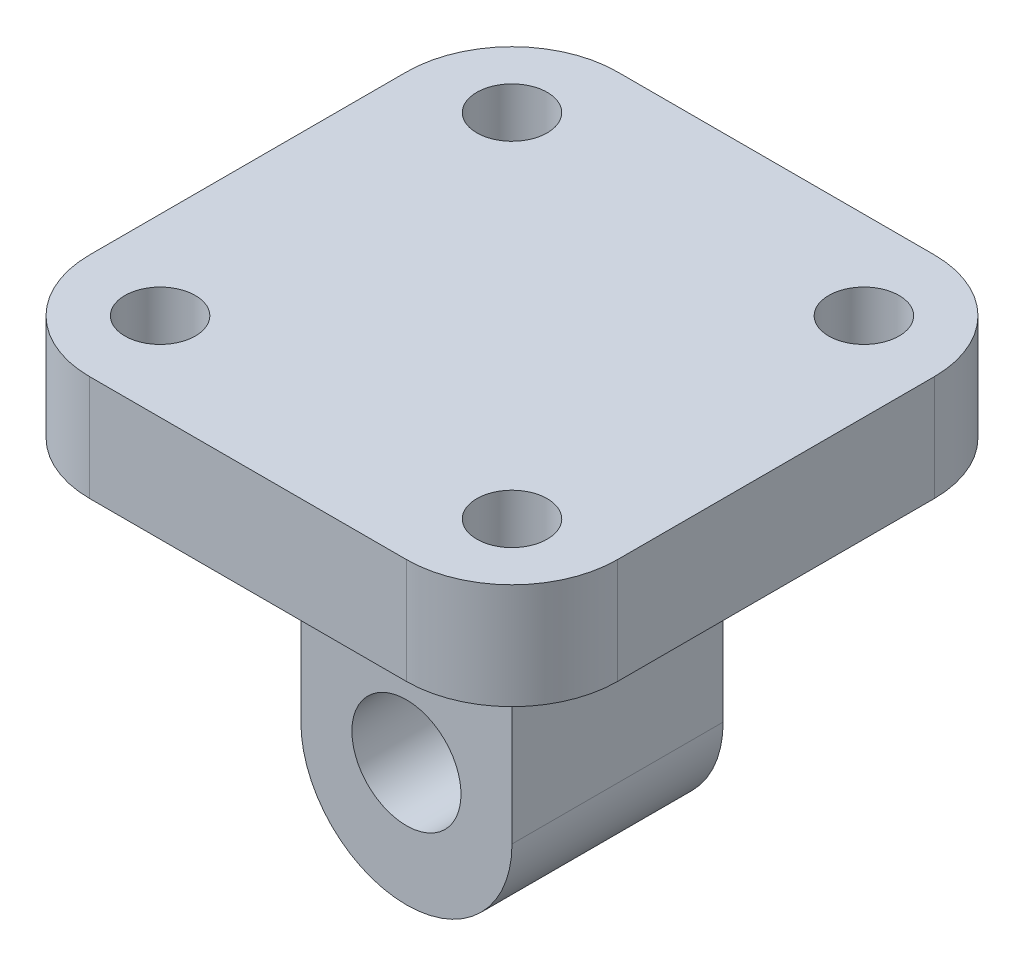
ISO-10303-21;
HEADER;
FILE_DESCRIPTION(('STEP AP214'),'2;1');
FILE_NAME('part.step','',(''),(''),'','','');
FILE_SCHEMA(('AUTOMOTIVE_DESIGN { 1 0 10303 214 1 1 1 1 }'));
ENDSEC;
DATA;
#1=APPLICATION_CONTEXT('core data for automotive mechanical design processes');
#2=APPLICATION_PROTOCOL_DEFINITION('international standard','automotive_design',2000,#1);
#3=PRODUCT_CONTEXT('',#1,'mechanical');
#4=PRODUCT('Part','Part','',(#3));
#5=PRODUCT_RELATED_PRODUCT_CATEGORY('part','',(#4));
#6=PRODUCT_DEFINITION_FORMATION('','',#4);
#7=PRODUCT_DEFINITION_CONTEXT('part definition',#1,'design');
#8=PRODUCT_DEFINITION('design','',#6,#7);
#9=PRODUCT_DEFINITION_SHAPE('','',#8);
#10=(LENGTH_UNIT() NAMED_UNIT(*) SI_UNIT(.MILLI.,.METRE.));
#11=(NAMED_UNIT(*) PLANE_ANGLE_UNIT() SI_UNIT($,.RADIAN.));
#12=(NAMED_UNIT(*) SI_UNIT($,.STERADIAN.) SOLID_ANGLE_UNIT());
#13=UNCERTAINTY_MEASURE_WITH_UNIT(LENGTH_MEASURE(1.E-05),#10,'distance_accuracy_value','');
#14=(GEOMETRIC_REPRESENTATION_CONTEXT(3) GLOBAL_UNCERTAINTY_ASSIGNED_CONTEXT((#13)) GLOBAL_UNIT_ASSIGNED_CONTEXT((#10,
#11,#12)) REPRESENTATION_CONTEXT('',''));
#15=CARTESIAN_POINT('',(0.,0.,0.));
#16=DIRECTION('',(0.,0.,1.));
#17=DIRECTION('',(1.,0.,0.));
#18=AXIS2_PLACEMENT_3D('',#15,#16,#17);
#19=CARTESIAN_POINT('',(0.,0.,0.));
#20=DIRECTION('',(0.,1.,0.));
#21=DIRECTION('',(0.,0.,1.));
#22=AXIS2_PLACEMENT_3D('',#19,#20,#21);
#23=PLANE('',#22);
#24=DIRECTION('',(0.,0.,-1.));
#25=VECTOR('',#24,1.);
#26=CARTESIAN_POINT('',(15.,0.,0.));
#27=LINE('',#26,#25);
#28=CARTESIAN_POINT('',(15.,0.,12.));
#29=VERTEX_POINT('',#28);
#30=CARTESIAN_POINT('',(15.,0.,3.));
#31=VERTEX_POINT('',#30);
#32=EDGE_CURVE('E185',#29,#31,#27,.T.);
#33=ORIENTED_EDGE('',*,*,#32,.F.);
#34=CARTESIAN_POINT('',(12.,0.,12.));
#35=DIRECTION('',(0.,1.,0.));
#36=DIRECTION('',(0.,0.,1.));
#37=AXIS2_PLACEMENT_3D('',#34,#35,#36);
#38=CIRCLE('',#37,3.);
#39=CARTESIAN_POINT('',(12.,0.,15.));
#40=VERTEX_POINT('',#39);
#41=EDGE_CURVE('E168',#29,#40,#38,.F.);
#42=ORIENTED_EDGE('',*,*,#41,.T.);
#43=DIRECTION('',(1.,0.,0.));
#44=VECTOR('',#43,1.);
#45=CARTESIAN_POINT('',(0.,0.,15.));
#46=LINE('',#45,#44);
#47=CARTESIAN_POINT('',(3.,0.,15.));
#48=VERTEX_POINT('',#47);
#49=EDGE_CURVE('E196',#48,#40,#46,.T.);
#50=ORIENTED_EDGE('',*,*,#49,.F.);
#51=CARTESIAN_POINT('',(3.,0.,12.));
#52=DIRECTION('',(0.,1.,0.));
#53=DIRECTION('',(0.,0.,1.));
#54=AXIS2_PLACEMENT_3D('',#51,#52,#53);
#55=CIRCLE('',#54,3.);
#56=CARTESIAN_POINT('',(0.,0.,12.));
#57=VERTEX_POINT('',#56);
#58=EDGE_CURVE('E179',#48,#57,#55,.F.);
#59=ORIENTED_EDGE('',*,*,#58,.T.);
#60=DIRECTION('',(0.,0.,1.));
#61=VECTOR('',#60,1.);
#62=CARTESIAN_POINT('',(0.,0.,0.));
#63=LINE('',#62,#61);
#64=CARTESIAN_POINT('',(0.,0.,3.));
#65=VERTEX_POINT('',#64);
#66=EDGE_CURVE('E201',#65,#57,#63,.T.);
#67=ORIENTED_EDGE('',*,*,#66,.F.);
#68=CARTESIAN_POINT('',(3.,0.,3.));
#69=DIRECTION('',(0.,1.,0.));
#70=DIRECTION('',(0.,0.,1.));
#71=AXIS2_PLACEMENT_3D('',#68,#69,#70);
#72=CIRCLE('',#71,3.);
#73=CARTESIAN_POINT('',(3.,0.,0.));
#74=VERTEX_POINT('',#73);
#75=EDGE_CURVE('E189',#65,#74,#72,.F.);
#76=ORIENTED_EDGE('',*,*,#75,.T.);
#77=DIRECTION('',(-1.,0.,0.));
#78=VECTOR('',#77,1.);
#79=CARTESIAN_POINT('',(0.,0.,0.));
#80=LINE('',#79,#78);
#81=CARTESIAN_POINT('',(12.,0.,0.));
#82=VERTEX_POINT('',#81);
#83=EDGE_CURVE('E195',#82,#74,#80,.T.);
#84=ORIENTED_EDGE('',*,*,#83,.F.);
#85=CARTESIAN_POINT('',(12.,0.,3.));
#86=DIRECTION('',(0.,1.,0.));
#87=DIRECTION('',(0.,0.,1.));
#88=AXIS2_PLACEMENT_3D('',#85,#86,#87);
#89=CIRCLE('',#88,3.);
#90=EDGE_CURVE('E194',#82,#31,#89,.F.);
#91=ORIENTED_EDGE('',*,*,#90,.T.);
#92=EDGE_LOOP('',(#33,#42,#50,#59,#67,#76,#84,#91));
#93=FACE_BOUND('',#92,.T.);
#94=CARTESIAN_POINT('',(2.49999999999996,0.,2.5));
#95=DIRECTION('',(0.,1.,0.));
#96=DIRECTION('',(0.,0.,1.));
#97=AXIS2_PLACEMENT_3D('',#94,#95,#96);
#98=CIRCLE('',#97,1.);
#99=CARTESIAN_POINT('',(3.49999999999997,0.,2.5));
#100=VERTEX_POINT('',#99);
#101=CARTESIAN_POINT('',(2.5,0.,3.5));
#102=VERTEX_POINT('',#101);
#103=EDGE_CURVE('E439',#100,#102,#98,.T.);
#104=ORIENTED_EDGE('',*,*,#103,.T.);
#105=DIRECTION('',(0.,0.,-1.));
#106=VECTOR('',#105,1.);
#107=CARTESIAN_POINT('',(2.5,0.,10.5));
#108=LINE('',#107,#106);
#109=CARTESIAN_POINT('',(2.5,0.,11.5));
#110=VERTEX_POINT('',#109);
#111=EDGE_CURVE('E257',#102,#110,#108,.F.);
#112=ORIENTED_EDGE('',*,*,#111,.T.);
#113=CARTESIAN_POINT('',(2.5,0.,12.5));
#114=DIRECTION('',(0.,1.,0.));
#115=DIRECTION('',(0.,0.,1.));
#116=AXIS2_PLACEMENT_3D('',#113,#114,#115);
#117=CIRCLE('',#116,1.);
#118=CARTESIAN_POINT('',(3.5,0.,12.5));
#119=VERTEX_POINT('',#118);
#120=EDGE_CURVE('E444',#110,#119,#117,.T.);
#121=ORIENTED_EDGE('',*,*,#120,.T.);
#122=DIRECTION('',(-1.,0.,0.));
#123=VECTOR('',#122,1.);
#124=CARTESIAN_POINT('',(10.5,0.,12.5));
#125=LINE('',#124,#123);
#126=CARTESIAN_POINT('',(11.5,0.,12.5));
#127=VERTEX_POINT('',#126);
#128=EDGE_CURVE('E255',#119,#127,#125,.F.);
#129=ORIENTED_EDGE('',*,*,#128,.T.);
#130=CARTESIAN_POINT('',(12.5,0.,12.5));
#131=DIRECTION('',(0.,1.,0.));
#132=DIRECTION('',(0.,0.,1.));
#133=AXIS2_PLACEMENT_3D('',#130,#131,#132);
#134=CIRCLE('',#133,1.);
#135=CARTESIAN_POINT('',(12.5,0.,11.5));
#136=VERTEX_POINT('',#135);
#137=EDGE_CURVE('E427',#127,#136,#134,.T.);
#138=ORIENTED_EDGE('',*,*,#137,.T.);
#139=DIRECTION('',(0.,0.,1.));
#140=VECTOR('',#139,1.);
#141=CARTESIAN_POINT('',(12.5,0.,4.5));
#142=LINE('',#141,#140);
#143=CARTESIAN_POINT('',(12.5,0.,3.5));
#144=VERTEX_POINT('',#143);
#145=EDGE_CURVE('E253',#136,#144,#142,.F.);
#146=ORIENTED_EDGE('',*,*,#145,.T.);
#147=CARTESIAN_POINT('',(12.5,0.,2.5));
#148=DIRECTION('',(0.,1.,0.));
#149=DIRECTION('',(0.,0.,1.));
#150=AXIS2_PLACEMENT_3D('',#147,#148,#149);
#151=CIRCLE('',#150,1.);
#152=CARTESIAN_POINT('',(11.5,0.,2.5));
#153=VERTEX_POINT('',#152);
#154=EDGE_CURVE('E433',#144,#153,#151,.T.);
#155=ORIENTED_EDGE('',*,*,#154,.T.);
#156=DIRECTION('',(1.,0.,0.));
#157=VECTOR('',#156,1.);
#158=CARTESIAN_POINT('',(4.5,0.,2.5));
#159=LINE('',#158,#157);
#160=EDGE_CURVE('E251',#153,#100,#159,.F.);
#161=ORIENTED_EDGE('',*,*,#160,.T.);
#162=EDGE_LOOP('',(#104,#112,#121,#129,#138,#146,#155,#161));
#163=FACE_BOUND('',#162,.T.);
#164=ADVANCED_FACE('F33',(#93,#163),#23,.F.);
#165=CARTESIAN_POINT('',(0.,3.,0.));
#166=DIRECTION('',(1.,0.,0.));
#167=DIRECTION('',(0.,0.,-1.));
#168=AXIS2_PLACEMENT_3D('',#165,#166,#167);
#169=PLANE('',#168);
#170=ORIENTED_EDGE('',*,*,#66,.T.);
#171=DIRECTION('',(0.,-1.,0.));
#172=VECTOR('',#171,1.);
#173=CARTESIAN_POINT('',(0.,3.,12.));
#174=LINE('',#173,#172);
#175=CARTESIAN_POINT('',(0.,3.,12.));
#176=VERTEX_POINT('',#175);
#177=EDGE_CURVE('E224',#57,#176,#174,.F.);
#178=ORIENTED_EDGE('',*,*,#177,.T.);
#179=DIRECTION('',(0.,0.,1.));
#180=VECTOR('',#179,1.);
#181=CARTESIAN_POINT('',(0.,3.,0.));
#182=LINE('',#181,#180);
#183=CARTESIAN_POINT('',(0.,3.,3.));
#184=VERTEX_POINT('',#183);
#185=EDGE_CURVE('E199',#184,#176,#182,.T.);
#186=ORIENTED_EDGE('',*,*,#185,.F.);
#187=DIRECTION('',(0.,-1.,0.));
#188=VECTOR('',#187,1.);
#189=CARTESIAN_POINT('',(0.,3.,3.));
#190=LINE('',#189,#188);
#191=EDGE_CURVE('E221',#184,#65,#190,.T.);
#192=ORIENTED_EDGE('',*,*,#191,.T.);
#193=EDGE_LOOP('',(#170,#178,#186,#192));
#194=FACE_BOUND('',#193,.T.);
#195=ADVANCED_FACE('F357',(#194),#169,.F.);
#196=CARTESIAN_POINT('',(0.,3.,15.));
#197=DIRECTION('',(0.,0.,-1.));
#198=DIRECTION('',(-1.,0.,0.));
#199=AXIS2_PLACEMENT_3D('',#196,#197,#198);
#200=PLANE('',#199);
#201=ORIENTED_EDGE('',*,*,#49,.T.);
#202=DIRECTION('',(0.,-1.,0.));
#203=VECTOR('',#202,1.);
#204=CARTESIAN_POINT('',(12.,3.,15.));
#205=LINE('',#204,#203);
#206=CARTESIAN_POINT('',(12.,3.,15.));
#207=VERTEX_POINT('',#206);
#208=EDGE_CURVE('E173',#40,#207,#205,.F.);
#209=ORIENTED_EDGE('',*,*,#208,.T.);
#210=DIRECTION('',(1.,0.,0.));
#211=VECTOR('',#210,1.);
#212=CARTESIAN_POINT('',(0.,3.,15.));
#213=LINE('',#212,#211);
#214=CARTESIAN_POINT('',(3.,3.,15.));
#215=VERTEX_POINT('',#214);
#216=EDGE_CURVE('E451',#215,#207,#213,.T.);
#217=ORIENTED_EDGE('',*,*,#216,.F.);
#218=DIRECTION('',(0.,-1.,0.));
#219=VECTOR('',#218,1.);
#220=CARTESIAN_POINT('',(3.,3.,15.));
#221=LINE('',#220,#219);
#222=EDGE_CURVE('E178',#215,#48,#221,.T.);
#223=ORIENTED_EDGE('',*,*,#222,.T.);
#224=EDGE_LOOP('',(#201,#209,#217,#223));
#225=FACE_BOUND('',#224,.T.);
#226=ADVANCED_FACE('F364',(#225),#200,.F.);
#227=CARTESIAN_POINT('',(15.,3.,0.));
#228=DIRECTION('',(-1.,0.,0.));
#229=DIRECTION('',(0.,0.,1.));
#230=AXIS2_PLACEMENT_3D('',#227,#228,#229);
#231=PLANE('',#230);
#232=DIRECTION('',(0.,0.,-1.));
#233=VECTOR('',#232,1.);
#234=CARTESIAN_POINT('',(15.,3.,0.));
#235=LINE('',#234,#233);
#236=CARTESIAN_POINT('',(15.,3.,12.));
#237=VERTEX_POINT('',#236);
#238=CARTESIAN_POINT('',(15.,3.,3.));
#239=VERTEX_POINT('',#238);
#240=EDGE_CURVE('E188',#237,#239,#235,.T.);
#241=ORIENTED_EDGE('',*,*,#240,.F.);
#242=DIRECTION('',(0.,-1.,0.));
#243=VECTOR('',#242,1.);
#244=CARTESIAN_POINT('',(15.,3.,12.));
#245=LINE('',#244,#243);
#246=EDGE_CURVE('E172',#237,#29,#245,.T.);
#247=ORIENTED_EDGE('',*,*,#246,.T.);
#248=ORIENTED_EDGE('',*,*,#32,.T.);
#249=DIRECTION('',(0.,-1.,0.));
#250=VECTOR('',#249,1.);
#251=CARTESIAN_POINT('',(15.,3.,3.));
#252=LINE('',#251,#250);
#253=EDGE_CURVE('E190',#31,#239,#252,.F.);
#254=ORIENTED_EDGE('',*,*,#253,.T.);
#255=EDGE_LOOP('',(#241,#247,#248,#254));
#256=FACE_BOUND('',#255,.T.);
#257=ADVANCED_FACE('F184',(#256),#231,.F.);
#258=CARTESIAN_POINT('',(0.,3.,0.));
#259=DIRECTION('',(0.,0.,1.));
#260=DIRECTION('',(1.,0.,0.));
#261=AXIS2_PLACEMENT_3D('',#258,#259,#260);
#262=PLANE('',#261);
#263=DIRECTION('',(-1.,0.,0.));
#264=VECTOR('',#263,1.);
#265=CARTESIAN_POINT('',(0.,3.,0.));
#266=LINE('',#265,#264);
#267=CARTESIAN_POINT('',(12.,3.,0.));
#268=VERTEX_POINT('',#267);
#269=CARTESIAN_POINT('',(3.,3.,0.));
#270=VERTEX_POINT('',#269);
#271=EDGE_CURVE('E205',#268,#270,#266,.T.);
#272=ORIENTED_EDGE('',*,*,#271,.F.);
#273=DIRECTION('',(0.,-1.,0.));
#274=VECTOR('',#273,1.);
#275=CARTESIAN_POINT('',(12.,3.,0.));
#276=LINE('',#275,#274);
#277=EDGE_CURVE('E228',#268,#82,#276,.T.);
#278=ORIENTED_EDGE('',*,*,#277,.T.);
#279=ORIENTED_EDGE('',*,*,#83,.T.);
#280=DIRECTION('',(0.,-1.,0.));
#281=VECTOR('',#280,1.);
#282=CARTESIAN_POINT('',(3.,3.,0.));
#283=LINE('',#282,#281);
#284=EDGE_CURVE('E226',#74,#270,#283,.F.);
#285=ORIENTED_EDGE('',*,*,#284,.T.);
#286=EDGE_LOOP('',(#272,#278,#279,#285));
#287=FACE_BOUND('',#286,.T.);
#288=ADVANCED_FACE('F370',(#287),#262,.F.);
#289=CARTESIAN_POINT('',(0.,3.,0.));
#290=DIRECTION('',(0.,1.,0.));
#291=DIRECTION('',(0.,0.,1.));
#292=AXIS2_PLACEMENT_3D('',#289,#290,#291);
#293=PLANE('',#292);
#294=CARTESIAN_POINT('',(12.5,3.,12.5));
#295=DIRECTION('',(0.,1.,0.));
#296=DIRECTION('',(0.,0.,1.));
#297=AXIS2_PLACEMENT_3D('',#294,#295,#296);
#298=CIRCLE('',#297,1.);
#299=CARTESIAN_POINT('',(12.5,3.,13.5));
#300=VERTEX_POINT('',#299);
#301=EDGE_CURVE('E430',#300,#300,#298,.T.);
#302=ORIENTED_EDGE('',*,*,#301,.F.);
#303=EDGE_LOOP('',(#302));
#304=FACE_BOUND('',#303,.T.);
#305=CARTESIAN_POINT('',(12.5,3.,2.5));
#306=DIRECTION('',(0.,1.,0.));
#307=DIRECTION('',(0.,0.,1.));
#308=AXIS2_PLACEMENT_3D('',#305,#306,#307);
#309=CIRCLE('',#308,1.);
#310=CARTESIAN_POINT('',(12.5,3.,3.5));
#311=VERTEX_POINT('',#310);
#312=EDGE_CURVE('E436',#311,#311,#309,.T.);
#313=ORIENTED_EDGE('',*,*,#312,.F.);
#314=EDGE_LOOP('',(#313));
#315=FACE_BOUND('',#314,.T.);
#316=CARTESIAN_POINT('',(2.49999999999996,3.,2.5));
#317=DIRECTION('',(0.,1.,0.));
#318=DIRECTION('',(0.,0.,1.));
#319=AXIS2_PLACEMENT_3D('',#316,#317,#318);
#320=CIRCLE('',#319,1.);
#321=CARTESIAN_POINT('',(2.49999999999996,3.,3.5));
#322=VERTEX_POINT('',#321);
#323=EDGE_CURVE('E426',#322,#322,#320,.T.);
#324=ORIENTED_EDGE('',*,*,#323,.F.);
#325=EDGE_LOOP('',(#324));
#326=FACE_BOUND('',#325,.T.);
#327=CARTESIAN_POINT('',(2.5,3.,12.5));
#328=DIRECTION('',(0.,1.,0.));
#329=DIRECTION('',(0.,0.,1.));
#330=AXIS2_PLACEMENT_3D('',#327,#328,#329);
#331=CIRCLE('',#330,1.);
#332=CARTESIAN_POINT('',(2.5,3.,13.5));
#333=VERTEX_POINT('',#332);
#334=EDGE_CURVE('E429',#333,#333,#331,.T.);
#335=ORIENTED_EDGE('',*,*,#334,.F.);
#336=EDGE_LOOP('',(#335));
#337=FACE_BOUND('',#336,.T.);
#338=ORIENTED_EDGE('',*,*,#216,.T.);
#339=CARTESIAN_POINT('',(12.,3.,12.));
#340=DIRECTION('',(0.,1.,0.));
#341=DIRECTION('',(0.,0.,1.));
#342=AXIS2_PLACEMENT_3D('',#339,#340,#341);
#343=CIRCLE('',#342,3.);
#344=EDGE_CURVE('E219',#207,#237,#343,.T.);
#345=ORIENTED_EDGE('',*,*,#344,.T.);
#346=ORIENTED_EDGE('',*,*,#240,.T.);
#347=CARTESIAN_POINT('',(12.,3.,3.));
#348=DIRECTION('',(0.,1.,0.));
#349=DIRECTION('',(0.,0.,1.));
#350=AXIS2_PLACEMENT_3D('',#347,#348,#349);
#351=CIRCLE('',#350,3.);
#352=EDGE_CURVE('E215',#239,#268,#351,.T.);
#353=ORIENTED_EDGE('',*,*,#352,.T.);
#354=ORIENTED_EDGE('',*,*,#271,.T.);
#355=CARTESIAN_POINT('',(3.,3.,3.));
#356=DIRECTION('',(0.,1.,0.));
#357=DIRECTION('',(0.,0.,1.));
#358=AXIS2_PLACEMENT_3D('',#355,#356,#357);
#359=CIRCLE('',#358,3.);
#360=EDGE_CURVE('E213',#270,#184,#359,.T.);
#361=ORIENTED_EDGE('',*,*,#360,.T.);
#362=ORIENTED_EDGE('',*,*,#185,.T.);
#363=CARTESIAN_POINT('',(3.,3.,12.));
#364=DIRECTION('',(0.,1.,0.));
#365=DIRECTION('',(0.,0.,1.));
#366=AXIS2_PLACEMENT_3D('',#363,#364,#365);
#367=CIRCLE('',#366,3.);
#368=EDGE_CURVE('E217',#176,#215,#367,.T.);
#369=ORIENTED_EDGE('',*,*,#368,.T.);
#370=EDGE_LOOP('',(#338,#345,#346,#353,#354,#361,#362,#369));
#371=FACE_BOUND('',#370,.T.);
#372=ADVANCED_FACE('F369',(#304,#315,#326,#337,#371),#293,.T.);
#373=CARTESIAN_POINT('',(2.5,0.,12.5));
#374=DIRECTION('',(0.,1.,0.));
#375=DIRECTION('',(0.,0.,1.));
#376=AXIS2_PLACEMENT_3D('',#373,#374,#375);
#377=CYLINDRICAL_SURFACE('',#376,1.);
#378=CARTESIAN_POINT('',(2.5,0.,11.5));
#379=CARTESIAN_POINT('',(2.52640180333268,2.64924350101226E-06,11.499998705182));
#380=CARTESIAN_POINT('',(2.55278937642562,-0.000523387453102627,11.5010463425146));
#381=CARTESIAN_POINT('',(2.60534952735425,-0.00260382393645436,11.5052154381789));
#382=CARTESIAN_POINT('',(2.63152218298236,-0.00415783337280311,11.5083361093227));
#383=CARTESIAN_POINT('',(2.70920047399927,-0.0102977843524348,11.5207301055521));
#384=CARTESIAN_POINT('',(2.76014211509002,-0.0163622677799502,11.5330359960663));
#385=CARTESIAN_POINT('',(2.85892780525675,-0.031834040648478,11.5651878812173));
#386=CARTESIAN_POINT('',(2.90677500432708,-0.041237865407464,11.5850260623137));
#387=CARTESIAN_POINT('',(2.99844728291163,-0.062536701636154,11.6315579419229));
#388=CARTESIAN_POINT('',(3.04227016571173,-0.0744330621922426,11.6582553547764));
#389=CARTESIAN_POINT('',(3.10568795580045,-0.0937795169253797,11.7038331289303));
#390=CARTESIAN_POINT('',(3.12704209361127,-0.10071237208584,11.7205437472963));
#391=CARTESIAN_POINT('',(3.16822005757542,-0.114806689591457,11.7555481269127));
#392=CARTESIAN_POINT('',(3.18804802572463,-0.121967452827616,11.7738372951724));
#393=CARTESIAN_POINT('',(3.20710678118655,-0.12917130661303,11.7928932188135));
#394=B_SPLINE_CURVE_WITH_KNOTS('',3,(#378,#379,#380,#381,#382,#383,#384,#385,#386,#387,#388,
#389,#390,#391,#392,#393),.UNSPECIFIED.,.F.,.F.,(4,2,2,2,2,2,2,4),(0.,0.0791518631060229,
0.158273687245464,0.315701689693855,0.472966830102965,0.630317311267802,0.714204480217141,
0.797855305489649),.UNSPECIFIED.);
#395=CARTESIAN_POINT('',(3.20710678118655,-0.12917130661303,11.7928932188135));
#396=VERTEX_POINT('',#395);
#397=EDGE_CURVE('E273',#110,#396,#394,.T.);
#398=ORIENTED_EDGE('',*,*,#397,.T.);
#399=CARTESIAN_POINT('',(3.20710678118655,-0.12917130661303,11.7928932188135));
#400=CARTESIAN_POINT('',(3.24582225886051,-0.114509631506998,11.8315795391901));
#401=CARTESIAN_POINT('',(3.2814163855766,-0.100052017649465,11.873557852516));
#402=CARTESIAN_POINT('',(3.34562384883322,-0.0727741457450642,11.9633686103649));
#403=CARTESIAN_POINT('',(3.37419951461683,-0.0599628921679715,12.0112306618911));
#404=CARTESIAN_POINT('',(3.42328718839398,-0.0373510463848847,12.1118191710885));
#405=CARTESIAN_POINT('',(3.44377206420896,-0.0275606079877281,12.1645612762958));
#406=CARTESIAN_POINT('',(3.47556111020055,-0.0121565893196397,12.2731573803136));
#407=CARTESIAN_POINT('',(3.4869030780324,-0.00652582073716252,12.3289975365081));
#408=CARTESIAN_POINT('',(3.49560904393304,-0.0021922191321529,12.404441590425));
#409=CARTESIAN_POINT('',(3.49725434609723,-0.00137153604835543,12.4235063555391));
#410=CARTESIAN_POINT('',(3.49944916459418,-0.000275689396311236,12.461710845539));
#411=CARTESIAN_POINT('',(3.49999888875343,-4.22365016079815E-07,12.4808505555178));
#412=CARTESIAN_POINT('',(3.5,0.,12.5));
#413=B_SPLINE_CURVE_WITH_KNOTS('',3,(#399,#400,#401,#402,#403,#404,#405,#406,#407,#408,#409,
#410,#411,#412),.UNSPECIFIED.,.F.,.F.,(4,2,2,2,2,2,4),(0.,0.169909956082648,0.340712876120193,
0.512083810947109,0.68274259541558,0.740172645603618,0.797591800518008),.UNSPECIFIED.);
#414=EDGE_CURVE('E327',#396,#119,#413,.T.);
#415=ORIENTED_EDGE('',*,*,#414,.T.);
#416=ORIENTED_EDGE('',*,*,#120,.F.);
#417=EDGE_LOOP('',(#398,#415,#416));
#418=FACE_BOUND('',#417,.T.);
#419=ORIENTED_EDGE('',*,*,#334,.T.);
#420=EDGE_LOOP('',(#419));
#421=FACE_BOUND('',#420,.T.);
#422=ADVANCED_FACE('F353',(#418,#421),#377,.F.);
#423=CARTESIAN_POINT('',(2.49999999999996,0.,2.5));
#424=DIRECTION('',(0.,1.,0.));
#425=DIRECTION('',(0.,0.,1.));
#426=AXIS2_PLACEMENT_3D('',#423,#424,#425);
#427=CYLINDRICAL_SURFACE('',#426,1.);
#428=ORIENTED_EDGE('',*,*,#103,.F.);
#429=CARTESIAN_POINT('',(3.49999999999997,0.,2.5));
#430=CARTESIAN_POINT('',(3.50000129481794,2.64924350101993E-06,2.52640180333268));
#431=CARTESIAN_POINT('',(3.49895365748535,-0.000523387453102599,2.55278937642562));
#432=CARTESIAN_POINT('',(3.49478456182108,-0.0026038239364543,2.60534952735425));
#433=CARTESIAN_POINT('',(3.49166389067722,-0.00415783337280303,2.63152218298236));
#434=CARTESIAN_POINT('',(3.47926989444785,-0.0102977843524347,2.70920047399927));
#435=CARTESIAN_POINT('',(3.4669640039337,-0.0163622677799501,2.76014211509002));
#436=CARTESIAN_POINT('',(3.43481211878264,-0.0318340406484782,2.85892780525675));
#437=CARTESIAN_POINT('',(3.41497393768624,-0.0412378654074642,2.90677500432707));
#438=CARTESIAN_POINT('',(3.36844205807707,-0.0625367016361543,2.99844728291163));
#439=CARTESIAN_POINT('',(3.34174464522355,-0.0744330621922428,3.04227016571173));
#440=CARTESIAN_POINT('',(3.2961668710697,-0.0937795169253786,3.10568795580045));
#441=CARTESIAN_POINT('',(3.27945625270367,-0.100712372085838,3.12704209361126));
#442=CARTESIAN_POINT('',(3.24445187308725,-0.114806689591452,3.16822005757541));
#443=CARTESIAN_POINT('',(3.22616270482755,-0.12196745282761,3.18804802572461));
#444=CARTESIAN_POINT('',(3.20710678118653,-0.129171306613022,3.20710678118653));
#445=B_SPLINE_CURVE_WITH_KNOTS('',3,(#429,#430,#431,#432,#433,#434,#435,#436,#437,#438,#439,
#440,#441,#442,#443,#444),.UNSPECIFIED.,.F.,.F.,(4,2,2,2,2,2,2,4),(0.,0.0791518631060225,
0.158273687245463,0.315701689693856,0.472966830102965,0.630317311267802,0.714204480217125,
0.79785530548962),.UNSPECIFIED.);
#446=CARTESIAN_POINT('',(3.20710678118653,-0.129171306613022,3.20710678118653));
#447=VERTEX_POINT('',#446);
#448=EDGE_CURVE('E11',#100,#447,#445,.T.);
#449=ORIENTED_EDGE('',*,*,#448,.T.);
#450=CARTESIAN_POINT('',(3.20710678118653,-0.129171306613022,3.20710678118653));
#451=CARTESIAN_POINT('',(3.16842046080985,-0.114509631506992,3.24582225886049));
#452=CARTESIAN_POINT('',(3.12644214748401,-0.100052017649459,3.28141638557658));
#453=CARTESIAN_POINT('',(3.03663138963511,-0.0727741457450602,3.34562384883321));
#454=CARTESIAN_POINT('',(2.98876933810885,-0.0599628921679682,3.37419951461682));
#455=CARTESIAN_POINT('',(2.88818082891148,-0.0373510463848825,3.42328718839397));
#456=CARTESIAN_POINT('',(2.83543872370417,-0.0275606079877262,3.44377206420895));
#457=CARTESIAN_POINT('',(2.72684261968638,-0.0121565893196385,3.47556111020054));
#458=CARTESIAN_POINT('',(2.67100246349194,-0.00652582073716172,3.48690307803239));
#459=CARTESIAN_POINT('',(2.59555840957495,-0.00219221913215275,3.49560904393303));
#460=CARTESIAN_POINT('',(2.5764936444609,-0.00137153604835547,3.49725434609722));
#461=CARTESIAN_POINT('',(2.53828915446097,-0.00027568939631158,3.49944916459417));
#462=CARTESIAN_POINT('',(2.51914944448216,-4.22365016504146E-07,3.49999888875343));
#463=CARTESIAN_POINT('',(2.5,0.,3.5));
#464=B_SPLINE_CURVE_WITH_KNOTS('',3,(#450,#451,#452,#453,#454,#455,#456,#457,#458,#459,#460,
#461,#462,#463),.UNSPECIFIED.,.F.,.F.,(4,2,2,2,2,2,4),(0.,0.169909956082645,0.340712876120192,
0.512083810947107,0.682742595415578,0.740172645603614,0.797591800517996),.UNSPECIFIED.);
#465=EDGE_CURVE('E266',#447,#102,#464,.T.);
#466=ORIENTED_EDGE('',*,*,#465,.T.);
#467=EDGE_LOOP('',(#428,#449,#466));
#468=FACE_BOUND('',#467,.T.);
#469=ORIENTED_EDGE('',*,*,#323,.T.);
#470=EDGE_LOOP('',(#469));
#471=FACE_BOUND('',#470,.T.);
#472=ADVANCED_FACE('F279',(#468,#471),#427,.F.);
#473=CARTESIAN_POINT('',(12.5,0.,2.5));
#474=DIRECTION('',(0.,1.,0.));
#475=DIRECTION('',(0.,0.,1.));
#476=AXIS2_PLACEMENT_3D('',#473,#474,#475);
#477=CYLINDRICAL_SURFACE('',#476,1.);
#478=ORIENTED_EDGE('',*,*,#154,.F.);
#479=CARTESIAN_POINT('',(12.5,0.,3.5));
#480=CARTESIAN_POINT('',(12.4735981966673,2.64924350078195E-06,3.50000129481797));
#481=CARTESIAN_POINT('',(12.4472106235744,-0.000523387453102785,3.49895365748539));
#482=CARTESIAN_POINT('',(12.3946504726458,-0.00260382393645424,3.49478456182112));
#483=CARTESIAN_POINT('',(12.3684778170176,-0.00415783337280278,3.49166389067726));
#484=CARTESIAN_POINT('',(12.2907995260007,-0.0102977843524343,3.47926989444789));
#485=CARTESIAN_POINT('',(12.23985788491,-0.0163622677799501,3.46696400393375));
#486=CARTESIAN_POINT('',(12.1410721947433,-0.0318340406484786,3.43481211878269));
#487=CARTESIAN_POINT('',(12.0932249956729,-0.0412378654074647,3.41497393768629));
#488=CARTESIAN_POINT('',(12.0015527170884,-0.062536701636155,3.36844205807712));
#489=CARTESIAN_POINT('',(11.9577298342883,-0.0744330621922438,3.3417446452236));
#490=CARTESIAN_POINT('',(11.8943120441995,-0.0937795169253819,3.29616687106976));
#491=CARTESIAN_POINT('',(11.8729579063887,-0.100712372085843,3.27945625270372));
#492=CARTESIAN_POINT('',(11.8317799424246,-0.114806689591462,3.24445187308729));
#493=CARTESIAN_POINT('',(11.8119519742754,-0.121967452827622,3.22616270482759));
#494=CARTESIAN_POINT('',(11.7928932188134,-0.129171306613037,3.20710678118657));
#495=B_SPLINE_CURVE_WITH_KNOTS('',3,(#479,#480,#481,#482,#483,#484,#485,#486,#487,#488,#489,
#490,#491,#492,#493,#494),.UNSPECIFIED.,.F.,.F.,(4,2,2,2,2,2,2,4),(0.,0.0791518631060228,
0.158273687245464,0.315701689693855,0.472966830102963,0.6303173112678,0.714204480217146,
0.797855305489661),.UNSPECIFIED.);
#496=CARTESIAN_POINT('',(11.7928932188134,-0.129171306613037,3.20710678118657));
#497=VERTEX_POINT('',#496);
#498=EDGE_CURVE('E51',#144,#497,#495,.T.);
#499=ORIENTED_EDGE('',*,*,#498,.T.);
#500=CARTESIAN_POINT('',(11.7928932188134,-0.129171306613037,3.20710678118657));
#501=CARTESIAN_POINT('',(11.7541777411395,-0.114509631507005,3.16842046080988));
#502=CARTESIAN_POINT('',(11.7185836144234,-0.100052017649471,3.12644214748405));
#503=CARTESIAN_POINT('',(11.6543761511668,-0.0727741457450703,3.03663138963514));
#504=CARTESIAN_POINT('',(11.6258004853831,-0.0599628921679772,2.98876933810888));
#505=CARTESIAN_POINT('',(11.576712811606,-0.0373510463848897,2.88818082891151));
#506=CARTESIAN_POINT('',(11.556227935791,-0.0275606079877325,2.8354387237042));
#507=CARTESIAN_POINT('',(11.5244388897994,-0.0121565893196422,2.72684261968641));
#508=CARTESIAN_POINT('',(11.5130969219676,-0.00652582073716371,2.67100246349197));
#509=CARTESIAN_POINT('',(11.5043909560669,-0.00219221913215361,2.59555840957497));
#510=CARTESIAN_POINT('',(11.5027456539027,-0.00137153604835609,2.57649364446092));
#511=CARTESIAN_POINT('',(11.5005508354058,-0.000275689396311823,2.53828915446098));
#512=CARTESIAN_POINT('',(11.5000011112465,-4.22365016599315E-07,2.51914944448217));
#513=CARTESIAN_POINT('',(11.5,0.,2.5));
#514=B_SPLINE_CURVE_WITH_KNOTS('',3,(#500,#501,#502,#503,#504,#505,#506,#507,#508,#509,#510,
#511,#512,#513),.UNSPECIFIED.,.F.,.F.,(4,2,2,2,2,2,4),(0.,0.169909956082646,0.340712876120194,
0.51208381094711,0.682742595415584,0.740172645603636,0.797591800518035),.UNSPECIFIED.);
#515=EDGE_CURVE('E43',#497,#153,#514,.T.);
#516=ORIENTED_EDGE('',*,*,#515,.T.);
#517=EDGE_LOOP('',(#478,#499,#516));
#518=FACE_BOUND('',#517,.T.);
#519=ORIENTED_EDGE('',*,*,#312,.T.);
#520=EDGE_LOOP('',(#519));
#521=FACE_BOUND('',#520,.T.);
#522=ADVANCED_FACE('F343',(#518,#521),#477,.F.);
#523=CARTESIAN_POINT('',(12.5,0.,12.5));
#524=DIRECTION('',(0.,1.,0.));
#525=DIRECTION('',(0.,0.,1.));
#526=AXIS2_PLACEMENT_3D('',#523,#524,#525);
#527=CYLINDRICAL_SURFACE('',#526,1.);
#528=CARTESIAN_POINT('',(11.5,0.,12.5));
#529=CARTESIAN_POINT('',(11.499998705182,2.64924350108005E-06,12.4735981966673));
#530=CARTESIAN_POINT('',(11.5010463425146,-0.000523387453102559,12.4472106235744));
#531=CARTESIAN_POINT('',(11.5052154381789,-0.00260382393645434,12.3946504726457));
#532=CARTESIAN_POINT('',(11.5083361093227,-0.0041578333728031,12.3684778170176));
#533=CARTESIAN_POINT('',(11.5207301055521,-0.0102977843524348,12.2907995260007));
#534=CARTESIAN_POINT('',(11.5330359960663,-0.0163622677799502,12.23985788491));
#535=CARTESIAN_POINT('',(11.5651878812173,-0.0318340406484781,12.1410721947433));
#536=CARTESIAN_POINT('',(11.5850260623137,-0.041237865407464,12.0932249956729));
#537=CARTESIAN_POINT('',(11.6315579419229,-0.062536701636154,12.0015527170884));
#538=CARTESIAN_POINT('',(11.6582553547764,-0.0744330621922425,11.9577298342883));
#539=CARTESIAN_POINT('',(11.7038331289303,-0.0937795169253797,11.8943120441995));
#540=CARTESIAN_POINT('',(11.7205437472963,-0.10071237208584,11.8729579063887));
#541=CARTESIAN_POINT('',(11.7555481269127,-0.114806689591457,11.8317799424246));
#542=CARTESIAN_POINT('',(11.7738372951724,-0.121967452827616,11.8119519742754));
#543=CARTESIAN_POINT('',(11.7928932188135,-0.12917130661303,11.7928932188134));
#544=B_SPLINE_CURVE_WITH_KNOTS('',3,(#528,#529,#530,#531,#532,#533,#534,#535,#536,#537,#538,
#539,#540,#541,#542,#543),.UNSPECIFIED.,.F.,.F.,(4,2,2,2,2,2,2,4),(0.,0.0791518631060247,
0.158273687245464,0.315701689693857,0.472966830102966,0.630317311267802,0.714204480217141,
0.79785530548965),.UNSPECIFIED.);
#545=CARTESIAN_POINT('',(11.7928932188135,-0.12917130661303,11.7928932188134));
#546=VERTEX_POINT('',#545);
#547=EDGE_CURVE('E59',#127,#546,#544,.T.);
#548=ORIENTED_EDGE('',*,*,#547,.T.);
#549=CARTESIAN_POINT('',(11.7928932188135,-0.129171306613029,11.7928932188134));
#550=CARTESIAN_POINT('',(11.8315795391901,-0.114509631506998,11.7541777411395));
#551=CARTESIAN_POINT('',(11.873557852516,-0.100052017649465,11.7185836144234));
#552=CARTESIAN_POINT('',(11.9633686103649,-0.0727741457450646,11.6543761511668));
#553=CARTESIAN_POINT('',(12.0112306618911,-0.0599628921679719,11.6258004853832));
#554=CARTESIAN_POINT('',(12.1118191710885,-0.0373510463848856,11.576712811606));
#555=CARTESIAN_POINT('',(12.1645612762958,-0.0275606079877293,11.556227935791));
#556=CARTESIAN_POINT('',(12.2731573803136,-0.0121565893196403,11.5244388897994));
#557=CARTESIAN_POINT('',(12.3289975365081,-0.00652582073716224,11.5130969219676));
#558=CARTESIAN_POINT('',(12.404441590425,-0.00219221913215254,11.504390956067));
#559=CARTESIAN_POINT('',(12.4235063555391,-0.00137153604835514,11.5027456539028));
#560=CARTESIAN_POINT('',(12.461710845539,-0.000275689396311227,11.5005508354058));
#561=CARTESIAN_POINT('',(12.4808505555178,-4.22365016225104E-07,11.5000011112466));
#562=CARTESIAN_POINT('',(12.5,0.,11.5));
#563=B_SPLINE_CURVE_WITH_KNOTS('',3,(#549,#550,#551,#552,#553,#554,#555,#556,#557,#558,#559,
#560,#561,#562),.UNSPECIFIED.,.F.,.F.,(4,2,2,2,2,2,4),(0.,0.169909956082645,0.340712876120189,
0.512083810947101,0.682742595415576,0.740172645603619,0.797591800518008),.UNSPECIFIED.);
#564=EDGE_CURVE('E324',#546,#136,#563,.T.);
#565=ORIENTED_EDGE('',*,*,#564,.T.);
#566=ORIENTED_EDGE('',*,*,#137,.F.);
#567=EDGE_LOOP('',(#548,#565,#566));
#568=FACE_BOUND('',#567,.T.);
#569=ORIENTED_EDGE('',*,*,#301,.T.);
#570=EDGE_LOOP('',(#569));
#571=FACE_BOUND('',#570,.T.);
#572=ADVANCED_FACE('F339',(#568,#571),#527,.F.);
#573=CARTESIAN_POINT('',(12.,3.,12.));
#574=DIRECTION('',(0.,-1.,0.));
#575=DIRECTION('',(0.,0.,-1.));
#576=AXIS2_PLACEMENT_3D('',#573,#574,#575);
#577=CYLINDRICAL_SURFACE('',#576,3.);
#578=ORIENTED_EDGE('',*,*,#344,.F.);
#579=ORIENTED_EDGE('',*,*,#208,.F.);
#580=ORIENTED_EDGE('',*,*,#41,.F.);
#581=ORIENTED_EDGE('',*,*,#246,.F.);
#582=EDGE_LOOP('',(#578,#579,#580,#581));
#583=FACE_BOUND('',#582,.T.);
#584=ADVANCED_FACE('F171',(#583),#577,.T.);
#585=CARTESIAN_POINT('',(3.,3.,12.));
#586=DIRECTION('',(0.,-1.,0.));
#587=DIRECTION('',(0.,0.,-1.));
#588=AXIS2_PLACEMENT_3D('',#585,#586,#587);
#589=CYLINDRICAL_SURFACE('',#588,3.);
#590=ORIENTED_EDGE('',*,*,#368,.F.);
#591=ORIENTED_EDGE('',*,*,#177,.F.);
#592=ORIENTED_EDGE('',*,*,#58,.F.);
#593=ORIENTED_EDGE('',*,*,#222,.F.);
#594=EDGE_LOOP('',(#590,#591,#592,#593));
#595=FACE_BOUND('',#594,.T.);
#596=ADVANCED_FACE('F381',(#595),#589,.T.);
#597=CARTESIAN_POINT('',(12.,3.,3.));
#598=DIRECTION('',(0.,-1.,0.));
#599=DIRECTION('',(0.,0.,-1.));
#600=AXIS2_PLACEMENT_3D('',#597,#598,#599);
#601=CYLINDRICAL_SURFACE('',#600,3.);
#602=ORIENTED_EDGE('',*,*,#352,.F.);
#603=ORIENTED_EDGE('',*,*,#253,.F.);
#604=ORIENTED_EDGE('',*,*,#90,.F.);
#605=ORIENTED_EDGE('',*,*,#277,.F.);
#606=EDGE_LOOP('',(#602,#603,#604,#605));
#607=FACE_BOUND('',#606,.T.);
#608=ADVANCED_FACE('F384',(#607),#601,.T.);
#609=CARTESIAN_POINT('',(3.,3.,3.));
#610=DIRECTION('',(0.,-1.,0.));
#611=DIRECTION('',(0.,0.,-1.));
#612=AXIS2_PLACEMENT_3D('',#609,#610,#611);
#613=CYLINDRICAL_SURFACE('',#612,3.);
#614=ORIENTED_EDGE('',*,*,#360,.F.);
#615=ORIENTED_EDGE('',*,*,#284,.F.);
#616=ORIENTED_EDGE('',*,*,#75,.F.);
#617=ORIENTED_EDGE('',*,*,#191,.F.);
#618=EDGE_LOOP('',(#614,#615,#616,#617));
#619=FACE_BOUND('',#618,.T.);
#620=ADVANCED_FACE('F388',(#619),#613,.T.);
#621=CARTESIAN_POINT('',(10.5,-10.,4.5));
#622=DIRECTION('',(-1.,0.,0.));
#623=DIRECTION('',(0.,0.,1.));
#624=AXIS2_PLACEMENT_3D('',#621,#622,#623);
#625=PLANE('',#624);
#626=DIRECTION('',(0.,1.,0.));
#627=VECTOR('',#626,1.);
#628=CARTESIAN_POINT('',(10.5,-10.,4.5));
#629=LINE('',#628,#627);
#630=CARTESIAN_POINT('',(10.5,-7.,4.5));
#631=VERTEX_POINT('',#630);
#632=CARTESIAN_POINT('',(10.5,-2.,4.5));
#633=VERTEX_POINT('',#632);
#634=EDGE_CURVE('E409',#631,#633,#629,.T.);
#635=ORIENTED_EDGE('',*,*,#634,.T.);
#636=DIRECTION('',(0.,0.,1.));
#637=VECTOR('',#636,1.);
#638=CARTESIAN_POINT('',(10.5,-2.,10.5));
#639=LINE('',#638,#637);
#640=CARTESIAN_POINT('',(10.5,-2.,10.5));
#641=VERTEX_POINT('',#640);
#642=EDGE_CURVE('E262',#633,#641,#639,.T.);
#643=ORIENTED_EDGE('',*,*,#642,.T.);
#644=DIRECTION('',(0.,1.,0.));
#645=VECTOR('',#644,1.);
#646=CARTESIAN_POINT('',(10.5,-10.,10.5));
#647=LINE('',#646,#645);
#648=CARTESIAN_POINT('',(10.5,-7.,10.5));
#649=VERTEX_POINT('',#648);
#650=EDGE_CURVE('E411',#649,#641,#647,.T.);
#651=ORIENTED_EDGE('',*,*,#650,.F.);
#652=DIRECTION('',(0.,0.,1.));
#653=VECTOR('',#652,1.);
#654=CARTESIAN_POINT('',(10.5,-7.,4.5));
#655=LINE('',#654,#653);
#656=EDGE_CURVE('E235',#649,#631,#655,.F.);
#657=ORIENTED_EDGE('',*,*,#656,.T.);
#658=EDGE_LOOP('',(#635,#643,#651,#657));
#659=FACE_BOUND('',#658,.T.);
#660=ADVANCED_FACE('F344',(#659),#625,.F.);
#661=CARTESIAN_POINT('',(10.5,-10.,10.5));
#662=DIRECTION('',(0.,0.,-1.));
#663=DIRECTION('',(-1.,0.,0.));
#664=AXIS2_PLACEMENT_3D('',#661,#662,#663);
#665=PLANE('',#664);
#666=CARTESIAN_POINT('',(7.5,-6.5,10.5));
#667=DIRECTION('',(0.,0.,-1.));
#668=DIRECTION('',(-1.,0.,0.));
#669=AXIS2_PLACEMENT_3D('',#666,#667,#668);
#670=CIRCLE('',#669,1.55);
#671=CARTESIAN_POINT('',(5.95,-6.5,10.5));
#672=VERTEX_POINT('',#671);
#673=EDGE_CURVE('E415',#672,#672,#670,.T.);
#674=ORIENTED_EDGE('',*,*,#673,.T.);
#675=EDGE_LOOP('',(#674));
#676=FACE_BOUND('',#675,.T.);
#677=ORIENTED_EDGE('',*,*,#650,.T.);
#678=DIRECTION('',(-1.,0.,0.));
#679=VECTOR('',#678,1.);
#680=CARTESIAN_POINT('',(4.5,-2.,10.5));
#681=LINE('',#680,#679);
#682=CARTESIAN_POINT('',(4.5,-2.,10.5));
#683=VERTEX_POINT('',#682);
#684=EDGE_CURVE('E260',#641,#683,#681,.T.);
#685=ORIENTED_EDGE('',*,*,#684,.T.);
#686=DIRECTION('',(0.,1.,0.));
#687=VECTOR('',#686,1.);
#688=CARTESIAN_POINT('',(4.5,-10.,10.5));
#689=LINE('',#688,#687);
#690=CARTESIAN_POINT('',(4.5,-7.,10.5));
#691=VERTEX_POINT('',#690);
#692=EDGE_CURVE('E417',#691,#683,#689,.T.);
#693=ORIENTED_EDGE('',*,*,#692,.F.);
#694=CARTESIAN_POINT('',(7.5,-7.,10.5));
#695=DIRECTION('',(0.,0.,-1.));
#696=DIRECTION('',(-1.,0.,0.));
#697=AXIS2_PLACEMENT_3D('',#694,#695,#696);
#698=CIRCLE('',#697,3.);
#699=CARTESIAN_POINT('',(7.5,-10.,10.5));
#700=VERTEX_POINT('',#699);
#701=EDGE_CURVE('E231',#691,#700,#698,.F.);
#702=ORIENTED_EDGE('',*,*,#701,.T.);
#703=CARTESIAN_POINT('',(7.5,-7.,10.5));
#704=DIRECTION('',(0.,0.,-1.));
#705=DIRECTION('',(-1.,0.,0.));
#706=AXIS2_PLACEMENT_3D('',#703,#704,#705);
#707=CIRCLE('',#706,3.);
#708=EDGE_CURVE('E233',#700,#649,#707,.F.);
#709=ORIENTED_EDGE('',*,*,#708,.T.);
#710=EDGE_LOOP('',(#677,#685,#693,#702,#709));
#711=FACE_BOUND('',#710,.T.);
#712=ADVANCED_FACE('F505',(#676,#711),#665,.F.);
#713=CARTESIAN_POINT('',(4.5,-10.,4.5));
#714=DIRECTION('',(1.,0.,0.));
#715=DIRECTION('',(0.,0.,-1.));
#716=AXIS2_PLACEMENT_3D('',#713,#714,#715);
#717=PLANE('',#716);
#718=ORIENTED_EDGE('',*,*,#692,.T.);
#719=DIRECTION('',(0.,0.,-1.));
#720=VECTOR('',#719,1.);
#721=CARTESIAN_POINT('',(4.5,-2.,4.5));
#722=LINE('',#721,#720);
#723=CARTESIAN_POINT('',(4.5,-2.,4.5));
#724=VERTEX_POINT('',#723);
#725=EDGE_CURVE('E244',#683,#724,#722,.T.);
#726=ORIENTED_EDGE('',*,*,#725,.T.);
#727=DIRECTION('',(0.,1.,0.));
#728=VECTOR('',#727,1.);
#729=CARTESIAN_POINT('',(4.5,-10.,4.5));
#730=LINE('',#729,#728);
#731=CARTESIAN_POINT('',(4.5,-7.,4.5));
#732=VERTEX_POINT('',#731);
#733=EDGE_CURVE('E414',#732,#724,#730,.T.);
#734=ORIENTED_EDGE('',*,*,#733,.F.);
#735=DIRECTION('',(0.,0.,-1.));
#736=VECTOR('',#735,1.);
#737=CARTESIAN_POINT('',(4.5,-7.,10.5));
#738=LINE('',#737,#736);
#739=EDGE_CURVE('E242',#732,#691,#738,.F.);
#740=ORIENTED_EDGE('',*,*,#739,.T.);
#741=EDGE_LOOP('',(#718,#726,#734,#740));
#742=FACE_BOUND('',#741,.T.);
#743=ADVANCED_FACE('F500',(#742),#717,.F.);
#744=CARTESIAN_POINT('',(10.5,-10.,4.5));
#745=DIRECTION('',(0.,0.,1.));
#746=DIRECTION('',(1.,0.,0.));
#747=AXIS2_PLACEMENT_3D('',#744,#745,#746);
#748=PLANE('',#747);
#749=CARTESIAN_POINT('',(7.5,-6.5,4.5));
#750=DIRECTION('',(0.,0.,-1.));
#751=DIRECTION('',(-1.,0.,0.));
#752=AXIS2_PLACEMENT_3D('',#749,#750,#751);
#753=CIRCLE('',#752,1.55);
#754=CARTESIAN_POINT('',(5.95,-6.5,4.5));
#755=VERTEX_POINT('',#754);
#756=EDGE_CURVE('E248',#755,#755,#753,.T.);
#757=ORIENTED_EDGE('',*,*,#756,.F.);
#758=EDGE_LOOP('',(#757));
#759=FACE_BOUND('',#758,.T.);
#760=ORIENTED_EDGE('',*,*,#733,.T.);
#761=DIRECTION('',(1.,0.,0.));
#762=VECTOR('',#761,1.);
#763=CARTESIAN_POINT('',(10.5,-2.,4.5));
#764=LINE('',#763,#762);
#765=EDGE_CURVE('E264',#724,#633,#764,.T.);
#766=ORIENTED_EDGE('',*,*,#765,.T.);
#767=ORIENTED_EDGE('',*,*,#634,.F.);
#768=CARTESIAN_POINT('',(7.5,-7.,4.5));
#769=DIRECTION('',(0.,0.,1.));
#770=DIRECTION('',(1.,0.,0.));
#771=AXIS2_PLACEMENT_3D('',#768,#769,#770);
#772=CIRCLE('',#771,3.);
#773=CARTESIAN_POINT('',(7.5,-10.,4.5));
#774=VERTEX_POINT('',#773);
#775=EDGE_CURVE('E240',#631,#774,#772,.F.);
#776=ORIENTED_EDGE('',*,*,#775,.T.);
#777=CARTESIAN_POINT('',(7.5,-7.,4.5));
#778=DIRECTION('',(0.,0.,1.));
#779=DIRECTION('',(1.,0.,0.));
#780=AXIS2_PLACEMENT_3D('',#777,#778,#779);
#781=CIRCLE('',#780,3.);
#782=EDGE_CURVE('E238',#774,#732,#781,.F.);
#783=ORIENTED_EDGE('',*,*,#782,.T.);
#784=EDGE_LOOP('',(#760,#766,#767,#776,#783));
#785=FACE_BOUND('',#784,.T.);
#786=ADVANCED_FACE('F413',(#759,#785),#748,.F.);
#787=CARTESIAN_POINT('',(7.5,-6.5,15.));
#788=DIRECTION('',(0.,0.,-1.));
#789=DIRECTION('',(-1.,0.,0.));
#790=AXIS2_PLACEMENT_3D('',#787,#788,#789);
#791=CYLINDRICAL_SURFACE('',#790,1.55);
#792=ORIENTED_EDGE('',*,*,#756,.T.);
#793=EDGE_LOOP('',(#792));
#794=FACE_BOUND('',#793,.T.);
#795=ORIENTED_EDGE('',*,*,#673,.F.);
#796=EDGE_LOOP('',(#795));
#797=FACE_BOUND('',#796,.T.);
#798=ADVANCED_FACE('F398',(#794,#797),#791,.F.);
#799=CARTESIAN_POINT('',(7.5,-7.,0.));
#800=DIRECTION('',(0.,0.,1.));
#801=DIRECTION('',(1.,0.,0.));
#802=AXIS2_PLACEMENT_3D('',#799,#800,#801);
#803=CYLINDRICAL_SURFACE('',#802,3.);
#804=ORIENTED_EDGE('',*,*,#739,.F.);
#805=ORIENTED_EDGE('',*,*,#782,.F.);
#806=DIRECTION('',(0.,0.,-1.));
#807=VECTOR('',#806,1.);
#808=CARTESIAN_POINT('',(7.5,-10.,4.5));
#809=LINE('',#808,#807);
#810=EDGE_CURVE('E245',#700,#774,#809,.T.);
#811=ORIENTED_EDGE('',*,*,#810,.F.);
#812=ORIENTED_EDGE('',*,*,#701,.F.);
#813=EDGE_LOOP('',(#804,#805,#811,#812));
#814=FACE_BOUND('',#813,.T.);
#815=ADVANCED_FACE('F289',(#814),#803,.T.);
#816=CARTESIAN_POINT('',(7.5,-7.,0.));
#817=DIRECTION('',(0.,0.,-1.));
#818=DIRECTION('',(-1.,0.,0.));
#819=AXIS2_PLACEMENT_3D('',#816,#817,#818);
#820=CYLINDRICAL_SURFACE('',#819,3.);
#821=ORIENTED_EDGE('',*,*,#775,.F.);
#822=ORIENTED_EDGE('',*,*,#656,.F.);
#823=ORIENTED_EDGE('',*,*,#708,.F.);
#824=ORIENTED_EDGE('',*,*,#810,.T.);
#825=EDGE_LOOP('',(#821,#822,#823,#824));
#826=FACE_BOUND('',#825,.T.);
#827=ADVANCED_FACE('F392',(#826),#820,.T.);
#828=CARTESIAN_POINT('',(12.5,-2.,4.5));
#829=DIRECTION('',(0.,0.,-1.));
#830=DIRECTION('',(-1.,0.,0.));
#831=AXIS2_PLACEMENT_3D('',#828,#829,#830);
#832=CYLINDRICAL_SURFACE('',#831,2.);
#833=ORIENTED_EDGE('',*,*,#145,.F.);
#834=ORIENTED_EDGE('',*,*,#564,.F.);
#835=CARTESIAN_POINT('',(12.5,-2.,12.5));
#836=DIRECTION('',(0.707106781186547,0.,-0.707106781186547));
#837=DIRECTION('',(0.707106781186547,0.,0.707106781186547));
#838=AXIS2_PLACEMENT_3D('',#835,#836,#837);
#839=ELLIPSE('',#838,2.82842712474619,2.);
#840=EDGE_CURVE('E38',#641,#546,#839,.T.);
#841=ORIENTED_EDGE('',*,*,#840,.F.);
#842=ORIENTED_EDGE('',*,*,#642,.F.);
#843=CARTESIAN_POINT('',(12.5,-2.,2.5));
#844=DIRECTION('',(-0.707106781186548,0.,-0.707106781186547));
#845=DIRECTION('',(0.707106781186547,0.,-0.707106781186548));
#846=AXIS2_PLACEMENT_3D('',#843,#844,#845);
#847=ELLIPSE('',#846,2.82842712474619,2.);
#848=EDGE_CURVE('E311',#497,#633,#847,.F.);
#849=ORIENTED_EDGE('',*,*,#848,.F.);
#850=ORIENTED_EDGE('',*,*,#498,.F.);
#851=EDGE_LOOP('',(#833,#834,#841,#842,#849,#850));
#852=FACE_BOUND('',#851,.T.);
#853=ADVANCED_FACE('F35',(#852),#832,.F.);
#854=CARTESIAN_POINT('',(10.5,-2.,12.5));
#855=DIRECTION('',(1.,0.,0.));
#856=DIRECTION('',(0.,0.,-1.));
#857=AXIS2_PLACEMENT_3D('',#854,#855,#856);
#858=CYLINDRICAL_SURFACE('',#857,2.);
#859=ORIENTED_EDGE('',*,*,#128,.F.);
#860=ORIENTED_EDGE('',*,*,#414,.F.);
#861=CARTESIAN_POINT('',(2.5,-2.,12.5));
#862=DIRECTION('',(0.707106781186547,0.,0.707106781186548));
#863=DIRECTION('',(-0.707106781186548,0.,0.707106781186547));
#864=AXIS2_PLACEMENT_3D('',#861,#862,#863);
#865=ELLIPSE('',#864,2.82842712474619,2.);
#866=EDGE_CURVE('E309',#683,#396,#865,.T.);
#867=ORIENTED_EDGE('',*,*,#866,.F.);
#868=ORIENTED_EDGE('',*,*,#684,.F.);
#869=ORIENTED_EDGE('',*,*,#840,.T.);
#870=ORIENTED_EDGE('',*,*,#547,.F.);
#871=EDGE_LOOP('',(#859,#860,#867,#868,#869,#870));
#872=FACE_BOUND('',#871,.T.);
#873=ADVANCED_FACE('F294',(#872),#858,.F.);
#874=CARTESIAN_POINT('',(10.5,-2.,2.5));
#875=DIRECTION('',(-1.,0.,0.));
#876=DIRECTION('',(0.,0.,1.));
#877=AXIS2_PLACEMENT_3D('',#874,#875,#876);
#878=CYLINDRICAL_SURFACE('',#877,2.);
#879=ORIENTED_EDGE('',*,*,#848,.T.);
#880=ORIENTED_EDGE('',*,*,#765,.F.);
#881=CARTESIAN_POINT('',(2.5,-2.,2.5));
#882=DIRECTION('',(-0.707106781186547,0.,0.707106781186547));
#883=DIRECTION('',(0.707106781186547,0.,0.707106781186547));
#884=AXIS2_PLACEMENT_3D('',#881,#882,#883);
#885=ELLIPSE('',#884,2.82842712474619,2.);
#886=EDGE_CURVE('E307',#447,#724,#885,.F.);
#887=ORIENTED_EDGE('',*,*,#886,.F.);
#888=ORIENTED_EDGE('',*,*,#448,.F.);
#889=ORIENTED_EDGE('',*,*,#160,.F.);
#890=ORIENTED_EDGE('',*,*,#515,.F.);
#891=EDGE_LOOP('',(#879,#880,#887,#888,#889,#890));
#892=FACE_BOUND('',#891,.T.);
#893=ADVANCED_FACE('F287',(#892),#878,.F.);
#894=CARTESIAN_POINT('',(2.5,-2.,4.5));
#895=DIRECTION('',(0.,0.,1.));
#896=DIRECTION('',(1.,0.,0.));
#897=AXIS2_PLACEMENT_3D('',#894,#895,#896);
#898=CYLINDRICAL_SURFACE('',#897,2.);
#899=ORIENTED_EDGE('',*,*,#397,.F.);
#900=ORIENTED_EDGE('',*,*,#111,.F.);
#901=ORIENTED_EDGE('',*,*,#465,.F.);
#902=ORIENTED_EDGE('',*,*,#886,.T.);
#903=ORIENTED_EDGE('',*,*,#725,.F.);
#904=ORIENTED_EDGE('',*,*,#866,.T.);
#905=EDGE_LOOP('',(#899,#900,#901,#902,#903,#904));
#906=FACE_BOUND('',#905,.T.);
#907=ADVANCED_FACE('F282',(#906),#898,.F.);
#908=CLOSED_SHELL('',(#164,#195,#226,#257,#288,#372,#422,#472,#522,#572,#584,#596,#608,#620,
#660,#712,#743,#786,#798,#815,#827,#853,#873,#893,#907));
#909=MANIFOLD_SOLID_BREP('B2',#908);
#910=ADVANCED_BREP_SHAPE_REPRESENTATION('',(#18,#909),#14);
#911=SHAPE_DEFINITION_REPRESENTATION(#9,#910);
ENDSEC;
END-ISO-10303-21;
